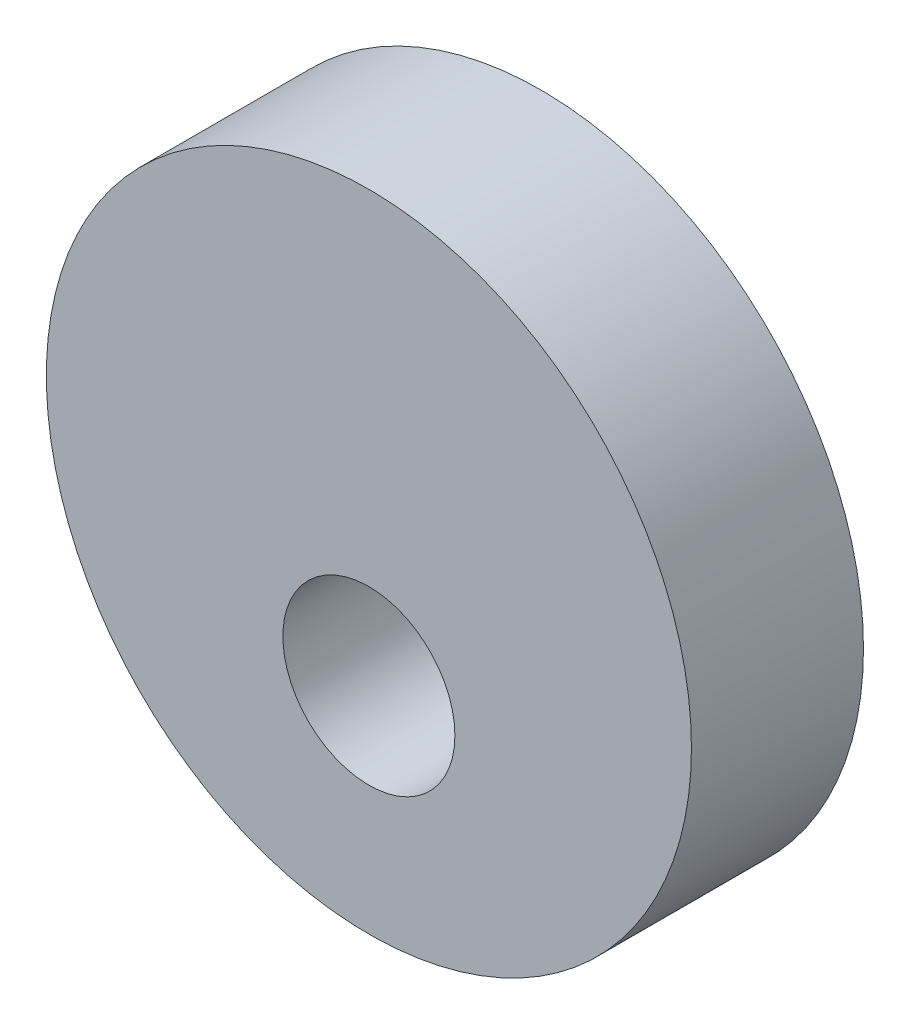
ISO-10303-21;
HEADER;
FILE_DESCRIPTION(('STEP AP214'),'2;1');
FILE_NAME('part.step','',(''),(''),'','','');
FILE_SCHEMA(('AUTOMOTIVE_DESIGN { 1 0 10303 214 1 1 1 1 }'));
ENDSEC;
DATA;
#1=APPLICATION_CONTEXT('core data for automotive mechanical design processes');
#2=APPLICATION_PROTOCOL_DEFINITION('international standard','automotive_design',2000,#1);
#3=PRODUCT_CONTEXT('',#1,'mechanical');
#4=PRODUCT('Part','Part','',(#3));
#5=PRODUCT_RELATED_PRODUCT_CATEGORY('part','',(#4));
#6=PRODUCT_DEFINITION_FORMATION('','',#4);
#7=PRODUCT_DEFINITION_CONTEXT('part definition',#1,'design');
#8=PRODUCT_DEFINITION('design','',#6,#7);
#9=PRODUCT_DEFINITION_SHAPE('','',#8);
#10=(LENGTH_UNIT() NAMED_UNIT(*) SI_UNIT(.MILLI.,.METRE.));
#11=(NAMED_UNIT(*) PLANE_ANGLE_UNIT() SI_UNIT($,.RADIAN.));
#12=(NAMED_UNIT(*) SI_UNIT($,.STERADIAN.) SOLID_ANGLE_UNIT());
#13=UNCERTAINTY_MEASURE_WITH_UNIT(LENGTH_MEASURE(1.E-05),#10,'distance_accuracy_value','');
#14=(GEOMETRIC_REPRESENTATION_CONTEXT(3) GLOBAL_UNCERTAINTY_ASSIGNED_CONTEXT((#13)) GLOBAL_UNIT_ASSIGNED_CONTEXT((#10,
#11,#12)) REPRESENTATION_CONTEXT('',''));
#15=CARTESIAN_POINT('',(0.,0.,0.));
#16=DIRECTION('',(0.,0.,1.));
#17=DIRECTION('',(1.,0.,0.));
#18=AXIS2_PLACEMENT_3D('',#15,#16,#17);
#19=CARTESIAN_POINT('',(0.,0.,8.));
#20=DIRECTION('',(0.,0.,-1.));
#21=DIRECTION('',(-1.,0.,0.));
#22=AXIS2_PLACEMENT_3D('',#19,#20,#21);
#23=CYLINDRICAL_SURFACE('',#22,15.);
#24=CARTESIAN_POINT('',(0.,0.,8.));
#25=DIRECTION('',(0.,0.,1.));
#26=DIRECTION('',(1.,0.,0.));
#27=AXIS2_PLACEMENT_3D('',#24,#25,#26);
#28=CIRCLE('',#27,15.);
#29=CARTESIAN_POINT('',(15.,0.,8.));
#30=VERTEX_POINT('',#29);
#31=EDGE_CURVE('E10',#30,#30,#28,.T.);
#32=ORIENTED_EDGE('',*,*,#31,.F.);
#33=EDGE_LOOP('',(#32));
#34=FACE_BOUND('',#33,.T.);
#35=CARTESIAN_POINT('',(0.,0.,0.));
#36=DIRECTION('',(0.,0.,1.));
#37=DIRECTION('',(1.,0.,0.));
#38=AXIS2_PLACEMENT_3D('',#35,#36,#37);
#39=CIRCLE('',#38,15.);
#40=CARTESIAN_POINT('',(15.,0.,0.));
#41=VERTEX_POINT('',#40);
#42=EDGE_CURVE('E46',#41,#41,#39,.T.);
#43=ORIENTED_EDGE('',*,*,#42,.T.);
#44=EDGE_LOOP('',(#43));
#45=FACE_BOUND('',#44,.T.);
#46=ADVANCED_FACE('F39',(#34,#45),#23,.T.);
#47=CARTESIAN_POINT('',(0.,0.,8.));
#48=DIRECTION('',(0.,0.,1.));
#49=DIRECTION('',(1.,0.,0.));
#50=AXIS2_PLACEMENT_3D('',#47,#48,#49);
#51=PLANE('',#50);
#52=CARTESIAN_POINT('',(0.,-5.,8.));
#53=DIRECTION('',(0.,0.,1.));
#54=DIRECTION('',(1.,0.,0.));
#55=AXIS2_PLACEMENT_3D('',#52,#53,#54);
#56=CIRCLE('',#55,4.);
#57=CARTESIAN_POINT('',(4.,-5.,8.));
#58=VERTEX_POINT('',#57);
#59=EDGE_CURVE('E52',#58,#58,#56,.T.);
#60=ORIENTED_EDGE('',*,*,#59,.F.);
#61=EDGE_LOOP('',(#60));
#62=FACE_BOUND('',#61,.T.);
#63=ORIENTED_EDGE('',*,*,#31,.T.);
#64=EDGE_LOOP('',(#63));
#65=FACE_BOUND('',#64,.T.);
#66=ADVANCED_FACE('F68',(#62,#65),#51,.T.);
#67=CARTESIAN_POINT('',(0.,0.,0.));
#68=DIRECTION('',(0.,0.,1.));
#69=DIRECTION('',(1.,0.,0.));
#70=AXIS2_PLACEMENT_3D('',#67,#68,#69);
#71=PLANE('',#70);
#72=CARTESIAN_POINT('',(0.,-5.,0.));
#73=DIRECTION('',(0.,0.,1.));
#74=DIRECTION('',(1.,0.,0.));
#75=AXIS2_PLACEMENT_3D('',#72,#73,#74);
#76=CIRCLE('',#75,4.);
#77=CARTESIAN_POINT('',(4.,-5.,0.));
#78=VERTEX_POINT('',#77);
#79=EDGE_CURVE('E42',#78,#78,#76,.T.);
#80=ORIENTED_EDGE('',*,*,#79,.T.);
#81=EDGE_LOOP('',(#80));
#82=FACE_BOUND('',#81,.T.);
#83=ORIENTED_EDGE('',*,*,#42,.F.);
#84=EDGE_LOOP('',(#83));
#85=FACE_BOUND('',#84,.T.);
#86=ADVANCED_FACE('F59',(#82,#85),#71,.F.);
#87=CARTESIAN_POINT('',(0.,-5.,-2.));
#88=DIRECTION('',(0.,0.,1.));
#89=DIRECTION('',(1.,0.,0.));
#90=AXIS2_PLACEMENT_3D('',#87,#88,#89);
#91=CYLINDRICAL_SURFACE('',#90,4.);
#92=ORIENTED_EDGE('',*,*,#59,.T.);
#93=EDGE_LOOP('',(#92));
#94=FACE_BOUND('',#93,.T.);
#95=ORIENTED_EDGE('',*,*,#79,.F.);
#96=EDGE_LOOP('',(#95));
#97=FACE_BOUND('',#96,.T.);
#98=ADVANCED_FACE('F62',(#94,#97),#91,.F.);
#99=CLOSED_SHELL('',(#46,#66,#86,#98));
#100=MANIFOLD_SOLID_BREP('B2',#99);
#101=ADVANCED_BREP_SHAPE_REPRESENTATION('',(#18,#100),#14);
#102=SHAPE_DEFINITION_REPRESENTATION(#9,#101);
ENDSEC;
END-ISO-10303-21;
